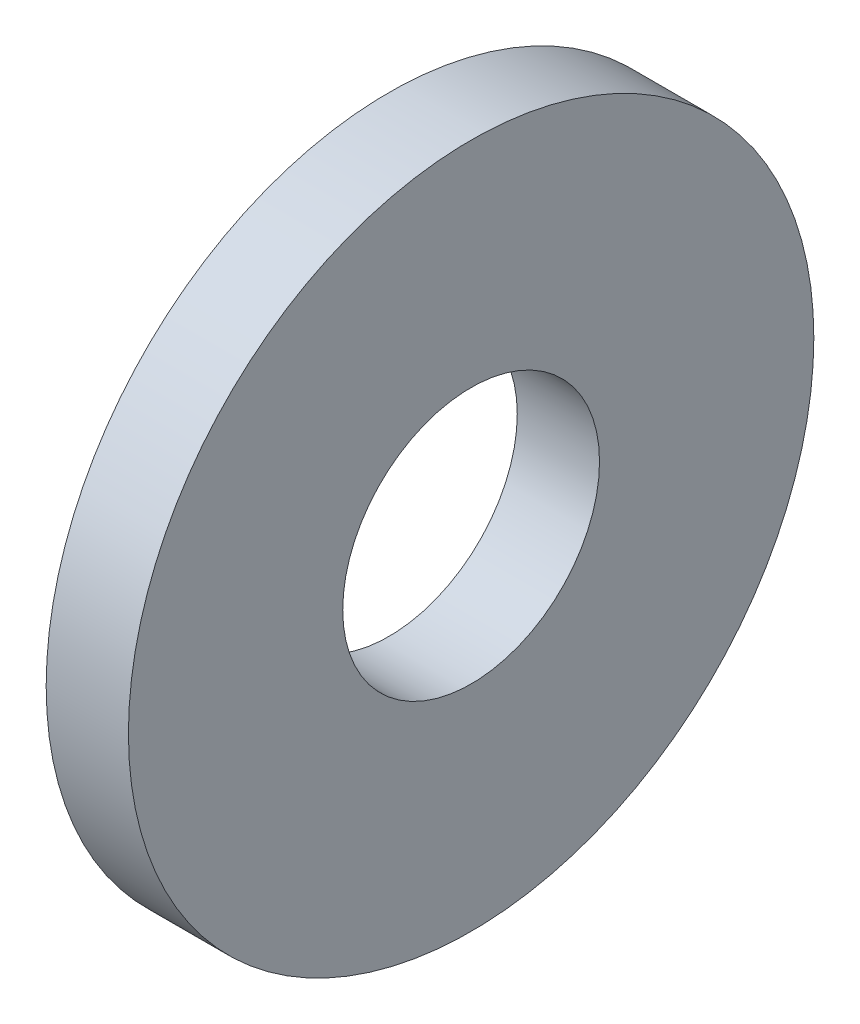
ISO-10303-21;
HEADER;
FILE_DESCRIPTION(('STEP AP214'),'2;1');
FILE_NAME('part.step','',(''),(''),'','','');
FILE_SCHEMA(('AUTOMOTIVE_DESIGN { 1 0 10303 214 1 1 1 1 }'));
ENDSEC;
DATA;
#1=APPLICATION_CONTEXT('core data for automotive mechanical design processes');
#2=APPLICATION_PROTOCOL_DEFINITION('international standard','automotive_design',2000,#1);
#3=PRODUCT_CONTEXT('',#1,'mechanical');
#4=PRODUCT('Part','Part','',(#3));
#5=PRODUCT_RELATED_PRODUCT_CATEGORY('part','',(#4));
#6=PRODUCT_DEFINITION_FORMATION('','',#4);
#7=PRODUCT_DEFINITION_CONTEXT('part definition',#1,'design');
#8=PRODUCT_DEFINITION('design','',#6,#7);
#9=PRODUCT_DEFINITION_SHAPE('','',#8);
#10=(LENGTH_UNIT() NAMED_UNIT(*) SI_UNIT(.MILLI.,.METRE.));
#11=(NAMED_UNIT(*) PLANE_ANGLE_UNIT() SI_UNIT($,.RADIAN.));
#12=(NAMED_UNIT(*) SI_UNIT($,.STERADIAN.) SOLID_ANGLE_UNIT());
#13=UNCERTAINTY_MEASURE_WITH_UNIT(LENGTH_MEASURE(1.E-05),#10,'distance_accuracy_value','');
#14=(GEOMETRIC_REPRESENTATION_CONTEXT(3) GLOBAL_UNCERTAINTY_ASSIGNED_CONTEXT((#13)) GLOBAL_UNIT_ASSIGNED_CONTEXT((#10,
#11,#12)) REPRESENTATION_CONTEXT('',''));
#15=CARTESIAN_POINT('',(0.,0.,0.));
#16=DIRECTION('',(0.,0.,1.));
#17=DIRECTION('',(1.,0.,0.));
#18=AXIS2_PLACEMENT_3D('',#15,#16,#17);
#19=CARTESIAN_POINT('',(2.286,0.,0.));
#20=DIRECTION('',(1.,0.,0.));
#21=DIRECTION('',(0.,0.,-1.));
#22=AXIS2_PLACEMENT_3D('',#19,#20,#21);
#23=PLANE('',#22);
#24=CARTESIAN_POINT('',(2.286,0.,0.));
#25=DIRECTION('',(1.,0.,0.));
#26=DIRECTION('',(0.,0.,-1.));
#27=AXIS2_PLACEMENT_3D('',#24,#25,#26);
#28=CIRCLE('',#27,9.525);
#29=CARTESIAN_POINT('',(2.286,0.,-9.525));
#30=VERTEX_POINT('',#29);
#31=EDGE_CURVE('E10',#30,#30,#28,.T.);
#32=ORIENTED_EDGE('',*,*,#31,.T.);
#33=EDGE_LOOP('',(#32));
#34=FACE_BOUND('',#33,.T.);
#35=CARTESIAN_POINT('',(2.286,0.,0.));
#36=DIRECTION('',(1.,0.,0.));
#37=DIRECTION('',(0.,0.,-1.));
#38=AXIS2_PLACEMENT_3D('',#35,#36,#37);
#39=CIRCLE('',#38,3.5687);
#40=CARTESIAN_POINT('',(2.286,0.,-3.5687));
#41=VERTEX_POINT('',#40);
#42=EDGE_CURVE('E41',#41,#41,#39,.T.);
#43=ORIENTED_EDGE('',*,*,#42,.F.);
#44=EDGE_LOOP('',(#43));
#45=FACE_BOUND('',#44,.T.);
#46=ADVANCED_FACE('F30',(#34,#45),#23,.T.);
#47=CARTESIAN_POINT('',(0.,0.,0.));
#48=DIRECTION('',(1.,0.,0.));
#49=DIRECTION('',(0.,0.,-1.));
#50=AXIS2_PLACEMENT_3D('',#47,#48,#49);
#51=PLANE('',#50);
#52=CARTESIAN_POINT('',(0.,0.,0.));
#53=DIRECTION('',(1.,0.,0.));
#54=DIRECTION('',(0.,0.,-1.));
#55=AXIS2_PLACEMENT_3D('',#52,#53,#54);
#56=CIRCLE('',#55,9.525);
#57=CARTESIAN_POINT('',(0.,0.,-9.525));
#58=VERTEX_POINT('',#57);
#59=EDGE_CURVE('E34',#58,#58,#56,.T.);
#60=ORIENTED_EDGE('',*,*,#59,.F.);
#61=EDGE_LOOP('',(#60));
#62=FACE_BOUND('',#61,.T.);
#63=CARTESIAN_POINT('',(0.,0.,0.));
#64=DIRECTION('',(1.,0.,0.));
#65=DIRECTION('',(0.,0.,-1.));
#66=AXIS2_PLACEMENT_3D('',#63,#64,#65);
#67=CIRCLE('',#66,3.5687);
#68=CARTESIAN_POINT('',(0.,0.,-3.5687));
#69=VERTEX_POINT('',#68);
#70=EDGE_CURVE('E43',#69,#69,#67,.T.);
#71=ORIENTED_EDGE('',*,*,#70,.T.);
#72=EDGE_LOOP('',(#71));
#73=FACE_BOUND('',#72,.T.);
#74=ADVANCED_FACE('F53',(#62,#73),#51,.F.);
#75=CARTESIAN_POINT('',(2.286,0.,0.));
#76=DIRECTION('',(-1.,0.,0.));
#77=DIRECTION('',(0.,0.,1.));
#78=AXIS2_PLACEMENT_3D('',#75,#76,#77);
#79=CYLINDRICAL_SURFACE('',#78,9.525);
#80=ORIENTED_EDGE('',*,*,#31,.F.);
#81=EDGE_LOOP('',(#80));
#82=FACE_BOUND('',#81,.T.);
#83=ORIENTED_EDGE('',*,*,#59,.T.);
#84=EDGE_LOOP('',(#83));
#85=FACE_BOUND('',#84,.T.);
#86=ADVANCED_FACE('F32',(#82,#85),#79,.T.);
#87=CARTESIAN_POINT('',(2.286,0.,0.));
#88=DIRECTION('',(-1.,0.,0.));
#89=DIRECTION('',(0.,0.,1.));
#90=AXIS2_PLACEMENT_3D('',#87,#88,#89);
#91=CYLINDRICAL_SURFACE('',#90,3.5687);
#92=ORIENTED_EDGE('',*,*,#42,.T.);
#93=EDGE_LOOP('',(#92));
#94=FACE_BOUND('',#93,.T.);
#95=ORIENTED_EDGE('',*,*,#70,.F.);
#96=EDGE_LOOP('',(#95));
#97=FACE_BOUND('',#96,.T.);
#98=ADVANCED_FACE('F49',(#94,#97),#91,.F.);
#99=CLOSED_SHELL('',(#46,#74,#86,#98));
#100=MANIFOLD_SOLID_BREP('B2',#99);
#101=ADVANCED_BREP_SHAPE_REPRESENTATION('',(#18,#100),#14);
#102=SHAPE_DEFINITION_REPRESENTATION(#9,#101);
ENDSEC;
END-ISO-10303-21;
